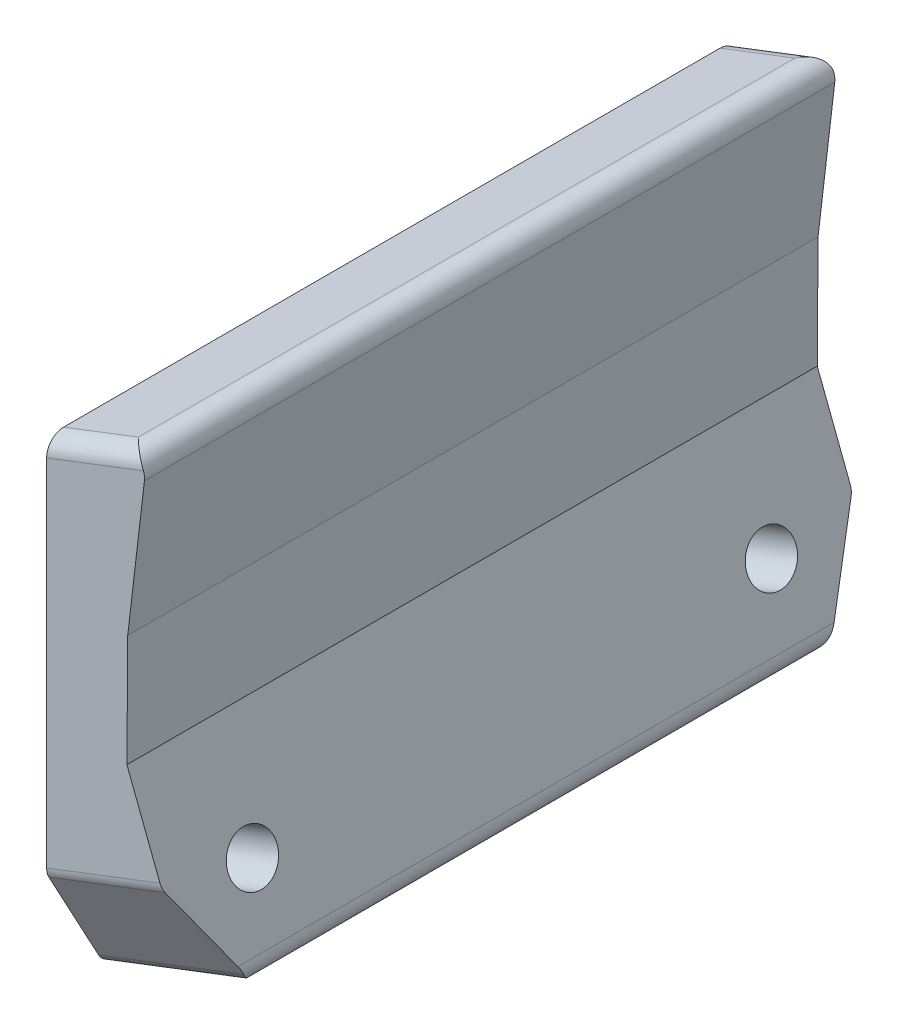
ISO-10303-21;
HEADER;
FILE_DESCRIPTION(('STEP AP214'),'2;1');
FILE_NAME('part.step','',(''),(''),'','','');
FILE_SCHEMA(('AUTOMOTIVE_DESIGN { 1 0 10303 214 1 1 1 1 }'));
ENDSEC;
DATA;
#1=APPLICATION_CONTEXT('core data for automotive mechanical design processes');
#2=APPLICATION_PROTOCOL_DEFINITION('international standard','automotive_design',2000,#1);
#3=PRODUCT_CONTEXT('',#1,'mechanical');
#4=PRODUCT('Part','Part','',(#3));
#5=PRODUCT_RELATED_PRODUCT_CATEGORY('part','',(#4));
#6=PRODUCT_DEFINITION_FORMATION('','',#4);
#7=PRODUCT_DEFINITION_CONTEXT('part definition',#1,'design');
#8=PRODUCT_DEFINITION('design','',#6,#7);
#9=PRODUCT_DEFINITION_SHAPE('','',#8);
#10=(LENGTH_UNIT() NAMED_UNIT(*) SI_UNIT(.MILLI.,.METRE.));
#11=(NAMED_UNIT(*) PLANE_ANGLE_UNIT() SI_UNIT($,.RADIAN.));
#12=(NAMED_UNIT(*) SI_UNIT($,.STERADIAN.) SOLID_ANGLE_UNIT());
#13=UNCERTAINTY_MEASURE_WITH_UNIT(LENGTH_MEASURE(1.E-05),#10,'distance_accuracy_value','');
#14=(GEOMETRIC_REPRESENTATION_CONTEXT(3) GLOBAL_UNCERTAINTY_ASSIGNED_CONTEXT((#13)) GLOBAL_UNIT_ASSIGNED_CONTEXT((#10,
#11,#12)) REPRESENTATION_CONTEXT('',''));
#15=CARTESIAN_POINT('',(0.,0.,0.));
#16=DIRECTION('',(0.,0.,1.));
#17=DIRECTION('',(1.,0.,0.));
#18=AXIS2_PLACEMENT_3D('',#15,#16,#17);
#19=CARTESIAN_POINT('',(0.,28.4733905031528,72.6486526726066));
#20=DIRECTION('',(1.,0.,0.));
#21=DIRECTION('',(0.,0.,-1.));
#22=AXIS2_PLACEMENT_3D('',#19,#20,#21);
#23=PLANE('',#22);
#24=CARTESIAN_POINT('',(0.,5.30631877565072,35.5946375623004));
#25=DIRECTION('',(1.,0.,0.));
#26=DIRECTION('',(0.,1.,0.));
#27=AXIS2_PLACEMENT_3D('',#24,#25,#26);
#28=ELLIPSE('',#27,2.94564875789305,2.74999999999999);
#29=CARTESIAN_POINT('',(0.,3.54191051814975,33.3925530595987));
#30=VERTEX_POINT('',#29);
#31=CARTESIAN_POINT('',(0.,3.54191051814975,37.7967220650021));
#32=VERTEX_POINT('',#31);
#33=EDGE_CURVE('E185',#30,#32,#28,.F.);
#34=ORIENTED_EDGE('',*,*,#33,.F.);
#35=DIRECTION('',(0.,0.,-1.));
#36=VECTOR('',#35,1.);
#37=CARTESIAN_POINT('',(0.,3.54191051814975,72.6486526726066));
#38=LINE('',#37,#36);
#39=CARTESIAN_POINT('',(0.,3.54191051814975,33.3614109376519));
#40=VERTEX_POINT('',#39);
#41=EDGE_CURVE('E194',#30,#40,#38,.T.);
#42=ORIENTED_EDGE('',*,*,#41,.T.);
#43=CARTESIAN_POINT('',(0.,4.27304450538204,35.5946375623004));
#44=DIRECTION('',(1.,0.,0.));
#45=DIRECTION('',(0.,-1.,0.));
#46=AXIS2_PLACEMENT_3D('',#43,#44,#45);
#47=ELLIPSE('',#46,2.69177132163688,2.32046425108158);
#48=CARTESIAN_POINT('',(0.,3.61167121680944,33.3453061200336));
#49=VERTEX_POINT('',#48);
#50=EDGE_CURVE('E233',#40,#49,#47,.T.);
#51=ORIENTED_EDGE('',*,*,#50,.T.);
#52=CARTESIAN_POINT('',(0.,5.30631877565072,35.5946375623004));
#53=DIRECTION('',(1.,0.,0.));
#54=DIRECTION('',(0.,-1.,0.));
#55=AXIS2_PLACEMENT_3D('',#52,#53,#54);
#56=ELLIPSE('',#55,2.94564875789305,2.75);
#57=CARTESIAN_POINT('',(0.,3.61167121680944,37.8439690045673));
#58=VERTEX_POINT('',#57);
#59=EDGE_CURVE('E348',#49,#58,#56,.T.);
#60=ORIENTED_EDGE('',*,*,#59,.T.);
#61=CARTESIAN_POINT('',(0.,3.54191051814975,37.8278641869489));
#62=VERTEX_POINT('',#61);
#63=EDGE_CURVE('E238',#58,#62,#47,.T.);
#64=ORIENTED_EDGE('',*,*,#63,.T.);
#65=EDGE_CURVE('E197',#62,#32,#38,.T.);
#66=ORIENTED_EDGE('',*,*,#65,.T.);
#67=EDGE_LOOP('',(#34,#42,#51,#60,#64,#66));
#68=FACE_BOUND('',#67,.T.);
#69=CARTESIAN_POINT('',(0.,5.29813431758588,5.04556541664107));
#70=DIRECTION('',(1.,0.,0.));
#71=DIRECTION('',(0.,1.,0.));
#72=AXIS2_PLACEMENT_3D('',#69,#70,#71);
#73=ELLIPSE('',#72,2.94564875789305,2.75);
#74=CARTESIAN_POINT('',(0.,3.54191051814976,2.83778597798238));
#75=VERTEX_POINT('',#74);
#76=CARTESIAN_POINT('',(0.,3.54191051814976,7.25334485529976));
#77=VERTEX_POINT('',#76);
#78=EDGE_CURVE('E466',#75,#77,#73,.F.);
#79=ORIENTED_EDGE('',*,*,#78,.F.);
#80=DIRECTION('',(0.,0.,-1.));
#81=VECTOR('',#80,1.);
#82=CARTESIAN_POINT('',(0.,3.54191051814975,72.6486526726066));
#83=LINE('',#82,#81);
#84=CARTESIAN_POINT('',(0.,3.54191051814975,2.80672307074797));
#85=VERTEX_POINT('',#84);
#86=EDGE_CURVE('E224',#75,#85,#83,.T.);
#87=ORIENTED_EDGE('',*,*,#86,.T.);
#88=CARTESIAN_POINT('',(0.,4.26344563880383,5.04556541664107));
#89=DIRECTION('',(1.,0.,0.));
#90=DIRECTION('',(0.,-1.,0.));
#91=AXIS2_PLACEMENT_3D('',#88,#89,#90);
#92=ELLIPSE('',#91,2.69545598154067,2.32364064333873);
#93=CARTESIAN_POINT('',(0.,3.61167121680944,2.79087905813103));
#94=VERTEX_POINT('',#93);
#95=EDGE_CURVE('E339',#85,#94,#92,.T.);
#96=ORIENTED_EDGE('',*,*,#95,.T.);
#97=CARTESIAN_POINT('',(0.,5.29813431758588,5.04556541664107));
#98=DIRECTION('',(1.,0.,0.));
#99=DIRECTION('',(0.,-1.,0.));
#100=AXIS2_PLACEMENT_3D('',#97,#98,#99);
#101=ELLIPSE('',#100,2.94564875789305,2.75);
#102=CARTESIAN_POINT('',(0.,3.61167121680944,7.30025177515111));
#103=VERTEX_POINT('',#102);
#104=EDGE_CURVE('E342',#94,#103,#101,.T.);
#105=ORIENTED_EDGE('',*,*,#104,.T.);
#106=CARTESIAN_POINT('',(0.,3.54191051814975,7.28440776253416));
#107=VERTEX_POINT('',#106);
#108=EDGE_CURVE('E344',#103,#107,#92,.T.);
#109=ORIENTED_EDGE('',*,*,#108,.T.);
#110=EDGE_CURVE('E227',#107,#77,#83,.T.);
#111=ORIENTED_EDGE('',*,*,#110,.T.);
#112=EDGE_LOOP('',(#79,#87,#96,#105,#109,#111));
#113=FACE_BOUND('',#112,.T.);
#114=DIRECTION('',(0.,0.,-1.));
#115=VECTOR('',#114,1.);
#116=CARTESIAN_POINT('',(0.,0.,72.6486526726066));
#117=LINE('',#116,#115);
#118=CARTESIAN_POINT('',(0.,0.,36.7160640643775));
#119=VERTEX_POINT('',#118);
#120=CARTESIAN_POINT('',(0.,0.,3.9239362011463));
#121=VERTEX_POINT('',#120);
#122=EDGE_CURVE('E312',#119,#121,#117,.T.);
#123=ORIENTED_EDGE('',*,*,#122,.F.);
#124=CARTESIAN_POINT('',(0.,1.0711450028702,36.7160640643775));
#125=DIRECTION('',(1.,0.,0.));
#126=DIRECTION('',(0.,1.,0.));
#127=AXIS2_PLACEMENT_3D('',#124,#125,#126);
#128=ELLIPSE('',#127,1.0711450028702,1.);
#129=CARTESIAN_POINT('',(0.,0.535592264773423,37.5821001203966));
#130=VERTEX_POINT('',#129);
#131=EDGE_CURVE('E11',#119,#130,#128,.F.);
#132=ORIENTED_EDGE('',*,*,#131,.T.);
#133=DIRECTION('',(0.,-0.880281845257962,-0.474451128051391));
#134=VECTOR('',#133,1.);
#135=CARTESIAN_POINT('',(0.,10.0195778629525,42.6937444076426));
#136=LINE('',#135,#134);
#137=CARTESIAN_POINT('',(0.,5.9605724205437,40.5060363215429));
#138=VERTEX_POINT('',#137);
#139=EDGE_CURVE('E296',#138,#130,#136,.T.);
#140=ORIENTED_EDGE('',*,*,#139,.F.);
#141=CARTESIAN_POINT('',(0.,6.49612515864048,39.6400002655238));
#142=DIRECTION('',(1.,0.,0.));
#143=DIRECTION('',(0.,-1.,0.));
#144=AXIS2_PLACEMENT_3D('',#141,#142,#143);
#145=ELLIPSE('',#144,1.0711450028702,1.);
#146=CARTESIAN_POINT('',(0.,6.49612515864048,40.6400002655238));
#147=VERTEX_POINT('',#146);
#148=EDGE_CURVE('E289',#138,#147,#145,.F.);
#149=ORIENTED_EDGE('',*,*,#148,.T.);
#150=DIRECTION('',(0.,-1.,0.));
#151=VECTOR('',#150,1.);
#152=CARTESIAN_POINT('',(0.,28.4733905031528,40.6400002655238));
#153=LINE('',#152,#151);
#154=CARTESIAN_POINT('',(0.,27.4019801819633,40.6400002655238));
#155=VERTEX_POINT('',#154);
#156=EDGE_CURVE('E326',#155,#147,#153,.T.);
#157=ORIENTED_EDGE('',*,*,#156,.F.);
#158=CARTESIAN_POINT('',(0.,27.4019801819633,39.6400002655238));
#159=DIRECTION('',(1.,0.,0.));
#160=DIRECTION('',(0.,1.,0.));
#161=AXIS2_PLACEMENT_3D('',#158,#159,#160);
#162=ELLIPSE('',#161,1.07141032118941,1.);
#163=CARTESIAN_POINT('',(0.,28.4733905031528,39.6400002655238));
#164=VERTEX_POINT('',#163);
#165=EDGE_CURVE('E41',#155,#164,#162,.F.);
#166=ORIENTED_EDGE('',*,*,#165,.T.);
#167=DIRECTION('',(0.,0.,-1.));
#168=VECTOR('',#167,1.);
#169=CARTESIAN_POINT('',(0.,28.4733905031528,72.6486526726066));
#170=LINE('',#169,#168);
#171=CARTESIAN_POINT('',(0.,28.4733905031528,1.));
#172=VERTEX_POINT('',#171);
#173=EDGE_CURVE('E322',#164,#172,#170,.T.);
#174=ORIENTED_EDGE('',*,*,#173,.T.);
#175=CARTESIAN_POINT('',(0.,27.4019801819634,1.));
#176=DIRECTION('',(1.,0.,0.));
#177=DIRECTION('',(0.,-1.,0.));
#178=AXIS2_PLACEMENT_3D('',#175,#176,#177);
#179=ELLIPSE('',#178,1.07141032118941,1.);
#180=CARTESIAN_POINT('',(0.,27.4019801819634,0.));
#181=VERTEX_POINT('',#180);
#182=EDGE_CURVE('E287',#172,#181,#179,.F.);
#183=ORIENTED_EDGE('',*,*,#182,.T.);
#184=DIRECTION('',(0.,-1.,0.));
#185=VECTOR('',#184,1.);
#186=CARTESIAN_POINT('',(0.,28.4733905031528,0.));
#187=LINE('',#186,#185);
#188=CARTESIAN_POINT('',(0.,6.49612515864048,0.));
#189=VERTEX_POINT('',#188);
#190=EDGE_CURVE('E317',#181,#189,#187,.T.);
#191=ORIENTED_EDGE('',*,*,#190,.T.);
#192=CARTESIAN_POINT('',(0.,6.49612515864048,1.));
#193=DIRECTION('',(1.,0.,0.));
#194=DIRECTION('',(0.,-1.,0.));
#195=AXIS2_PLACEMENT_3D('',#192,#193,#194);
#196=ELLIPSE('',#195,1.0711450028702,1.);
#197=CARTESIAN_POINT('',(0.,5.9605724205437,0.133963943980832));
#198=VERTEX_POINT('',#197);
#199=EDGE_CURVE('E285',#189,#198,#196,.F.);
#200=ORIENTED_EDGE('',*,*,#199,.T.);
#201=DIRECTION('',(0.,-0.880281845257962,0.474451128051391));
#202=VECTOR('',#201,1.);
#203=CARTESIAN_POINT('',(0.,10.0195778629525,-2.05374414211887));
#204=LINE('',#203,#202);
#205=CARTESIAN_POINT('',(0.,0.535592264773427,3.05790014512713));
#206=VERTEX_POINT('',#205);
#207=EDGE_CURVE('E453',#198,#206,#204,.T.);
#208=ORIENTED_EDGE('',*,*,#207,.T.);
#209=CARTESIAN_POINT('',(0.,1.0711450028702,3.9239362011463));
#210=DIRECTION('',(1.,0.,0.));
#211=DIRECTION('',(0.,-1.,0.));
#212=AXIS2_PLACEMENT_3D('',#209,#210,#211);
#213=ELLIPSE('',#212,1.0711450028702,1.);
#214=EDGE_CURVE('E283',#206,#121,#213,.F.);
#215=ORIENTED_EDGE('',*,*,#214,.T.);
#216=EDGE_LOOP('',(#123,#132,#140,#149,#157,#166,#174,#183,#191,#200,#208,#215));
#217=FACE_BOUND('',#216,.T.);
#218=ADVANCED_FACE('F32',(#68,#113,#217),#23,.F.);
#219=CARTESIAN_POINT('',(0.,0.,72.6486526726066));
#220=DIRECTION('',(-0.358367970509439,0.933580418449823,0.));
#221=DIRECTION('',(-0.933580418449823,-0.358367970509439,0.));
#222=AXIS2_PLACEMENT_3D('',#219,#220,#221);
#223=PLANE('',#222);
#224=DIRECTION('',(0.,0.,-1.));
#225=VECTOR('',#224,1.);
#226=CARTESIAN_POINT('',(7.911843087609,3.03707221602138,72.6486526726066));
#227=LINE('',#226,#225);
#228=CARTESIAN_POINT('',(7.911843087609,3.03707221602138,3.9239362011463));
#229=VERTEX_POINT('',#228);
#230=CARTESIAN_POINT('',(7.911843087609,3.03707221602138,36.7160640643775));
#231=VERTEX_POINT('',#230);
#232=EDGE_CURVE('E274',#229,#231,#227,.F.);
#233=ORIENTED_EDGE('',*,*,#232,.T.);
#234=DIRECTION('',(0.933580418449823,0.358367970509439,0.));
#235=VECTOR('',#234,1.);
#236=CARTESIAN_POINT('',(0.,0.,36.7160640643775));
#237=LINE('',#236,#235);
#238=EDGE_CURVE('E276',#231,#119,#237,.F.);
#239=ORIENTED_EDGE('',*,*,#238,.T.);
#240=ORIENTED_EDGE('',*,*,#122,.T.);
#241=DIRECTION('',(0.933580418449823,0.358367970509439,0.));
#242=VECTOR('',#241,1.);
#243=CARTESIAN_POINT('',(8.84542350605882,3.39544018653082,3.9239362011463));
#244=LINE('',#243,#242);
#245=EDGE_CURVE('E272',#121,#229,#244,.T.);
#246=ORIENTED_EDGE('',*,*,#245,.T.);
#247=EDGE_LOOP('',(#233,#239,#240,#246));
#248=FACE_BOUND('',#247,.T.);
#249=ADVANCED_FACE('F311',(#248),#223,.F.);
#250=CARTESIAN_POINT('',(8.84542350605882,3.39544018653082,72.6486526726066));
#251=DIRECTION('',(-0.933580418449822,-0.358367970509439,0.));
#252=DIRECTION('',(0.358367970509439,-0.933580418449822,0.));
#253=AXIS2_PLACEMENT_3D('',#250,#251,#252);
#254=PLANE('',#253);
#255=CARTESIAN_POINT('',(7.07285150339623,8.01314781711439,5.04556541664107));
#256=DIRECTION('',(-0.933580418449822,-0.358367970509439,0.));
#257=DIRECTION('',(0.358367970509439,-0.933580418449822,0.));
#258=AXIS2_PLACEMENT_3D('',#255,#256,#257);
#259=CIRCLE('',#258,1.45);
#260=CARTESIAN_POINT('',(7.59248506063491,6.65945621036215,5.04556541664107));
#261=VERTEX_POINT('',#260);
#262=EDGE_CURVE('E336',#261,#261,#259,.T.);
#263=ORIENTED_EDGE('',*,*,#262,.T.);
#264=EDGE_LOOP('',(#263));
#265=FACE_BOUND('',#264,.T.);
#266=CARTESIAN_POINT('',(7.07011326756582,8.02028116485394,35.5946375623004));
#267=DIRECTION('',(-0.933580418449822,-0.358367970509439,0.));
#268=DIRECTION('',(0.358367970509439,-0.933580418449822,0.));
#269=AXIS2_PLACEMENT_3D('',#266,#267,#268);
#270=CIRCLE('',#269,1.45);
#271=CARTESIAN_POINT('',(7.58974682480451,6.6665895581017,35.5946375623004));
#272=VERTEX_POINT('',#271);
#273=EDGE_CURVE('E206',#272,#272,#270,.T.);
#274=ORIENTED_EDGE('',*,*,#273,.T.);
#275=EDGE_LOOP('',(#274));
#276=FACE_BOUND('',#275,.T.);
#277=DIRECTION('',(-0.310359583783588,0.808514303571008,0.49998154933434));
#278=VECTOR('',#277,1.);
#279=CARTESIAN_POINT('',(5.1226133917929,13.0936914542011,43.2907827868172));
#280=LINE('',#279,#278);
#281=CARTESIAN_POINT('',(8.48705553554938,4.32902060498065,37.8707503999518));
#282=VERTEX_POINT('',#281);
#283=CARTESIAN_POINT('',(6.85122268758791,8.59051058284575,40.5060363215429));
#284=VERTEX_POINT('',#283);
#285=EDGE_CURVE('E458',#282,#284,#280,.T.);
#286=ORIENTED_EDGE('',*,*,#285,.F.);
#287=DIRECTION('',(0.,0.,-1.));
#288=VECTOR('',#287,1.);
#289=CARTESIAN_POINT('',(8.48705553554938,4.32902060498064,72.6486526726066));
#290=LINE('',#289,#288);
#291=CARTESIAN_POINT('',(8.48705553554938,4.32902060498065,2.76924986557199));
#292=VERTEX_POINT('',#291);
#293=EDGE_CURVE('E262',#282,#292,#290,.T.);
#294=ORIENTED_EDGE('',*,*,#293,.T.);
#295=DIRECTION('',(-0.310359583783588,0.808514303571008,-0.49998154933434));
#296=VECTOR('',#295,1.);
#297=CARTESIAN_POINT('',(5.1226133917929,13.0936914542011,-2.65078252129341));
#298=LINE('',#297,#296);
#299=CARTESIAN_POINT('',(6.85122268758791,8.59051058284575,0.133963943980833));
#300=VERTEX_POINT('',#299);
#301=EDGE_CURVE('E189',#292,#300,#298,.T.);
#302=ORIENTED_EDGE('',*,*,#301,.T.);
#303=CARTESIAN_POINT('',(6.6720453144608,9.05728356689049,1.));
#304=DIRECTION('',(-0.933580418449822,-0.358367970509439,0.));
#305=DIRECTION('',(0.358367970509439,-0.933580418449822,0.));
#306=AXIS2_PLACEMENT_3D('',#303,#304,#305);
#307=CIRCLE('',#306,1.);
#308=CARTESIAN_POINT('',(6.6720453144608,9.05728356689049,0.));
#309=VERTEX_POINT('',#308);
#310=EDGE_CURVE('E258',#300,#309,#307,.F.);
#311=ORIENTED_EDGE('',*,*,#310,.T.);
#312=DIRECTION('',(-0.358367970509439,0.933580418449822,0.));
#313=VECTOR('',#312,1.);
#314=CARTESIAN_POINT('',(8.84542350605882,3.39544018653082,0.));
#315=LINE('',#314,#313);
#316=CARTESIAN_POINT('',(4.72652132843694,14.1255464878049,0.));
#317=VERTEX_POINT('',#316);
#318=EDGE_CURVE('E316',#309,#317,#315,.T.);
#319=ORIENTED_EDGE('',*,*,#318,.T.);
#320=DIRECTION('',(0.,0.,-1.));
#321=VECTOR('',#320,1.);
#322=CARTESIAN_POINT('',(4.72652132843694,14.1255464878049,72.6486526726066));
#323=LINE('',#322,#321);
#324=CARTESIAN_POINT('',(4.72652132843694,14.1255464878049,40.6400002655238));
#325=VERTEX_POINT('',#324);
#326=EDGE_CURVE('E319',#325,#317,#323,.T.);
#327=ORIENTED_EDGE('',*,*,#326,.F.);
#328=DIRECTION('',(-0.358367970509439,0.933580418449822,0.));
#329=VECTOR('',#328,1.);
#330=CARTESIAN_POINT('',(8.84542350605882,3.39544018653082,40.6400002655238));
#331=LINE('',#330,#329);
#332=CARTESIAN_POINT('',(6.6720453144608,9.05728356689049,40.6400002655238));
#333=VERTEX_POINT('',#332);
#334=EDGE_CURVE('E424',#333,#325,#331,.T.);
#335=ORIENTED_EDGE('',*,*,#334,.F.);
#336=CARTESIAN_POINT('',(6.6720453144608,9.05728356689049,39.6400002655238));
#337=DIRECTION('',(-0.933580418449822,-0.358367970509439,0.));
#338=DIRECTION('',(0.358367970509439,-0.933580418449822,0.));
#339=AXIS2_PLACEMENT_3D('',#336,#337,#338);
#340=CIRCLE('',#339,1.);
#341=EDGE_CURVE('E260',#333,#284,#340,.F.);
#342=ORIENTED_EDGE('',*,*,#341,.T.);
#343=EDGE_LOOP('',(#286,#294,#302,#311,#319,#327,#335,#342));
#344=FACE_BOUND('',#343,.T.);
#345=ADVANCED_FACE('F380',(#265,#276,#344),#254,.F.);
#346=CARTESIAN_POINT('',(0.,0.,0.));
#347=DIRECTION('',(0.,0.,1.));
#348=DIRECTION('',(1.,0.,0.));
#349=AXIS2_PLACEMENT_3D('',#346,#347,#348);
#350=PLANE('',#349);
#351=DIRECTION('',(-0.933349231590252,-0.358969653160105,0.));
#352=VECTOR('',#351,1.);
#353=CARTESIAN_POINT('',(-9.1808704165736,23.8709826114933,0.));
#354=LINE('',#353,#352);
#355=CARTESIAN_POINT('',(5.69808427723476,29.5934849986449,0.));
#356=VERTEX_POINT('',#355);
#357=EDGE_CURVE('E245',#181,#356,#354,.F.);
#358=ORIENTED_EDGE('',*,*,#357,.T.);
#359=CARTESIAN_POINT('',(4.76473504564451,29.2345153454847,0.));
#360=DIRECTION('',(0.,0.,1.));
#361=DIRECTION('',(1.,0.,0.));
#362=AXIS2_PLACEMENT_3D('',#359,#360,#361);
#363=CIRCLE('',#362,1.);
#364=CARTESIAN_POINT('',(5.75790672308759,29.1178533588528,0.));
#365=VERTEX_POINT('',#364);
#366=EDGE_CURVE('E247',#356,#365,#363,.F.);
#367=ORIENTED_EDGE('',*,*,#366,.T.);
#368=DIRECTION('',(0.116661986631909,0.993171677443077,0.));
#369=VECTOR('',#368,1.);
#370=CARTESIAN_POINT('',(5.95105715467456,30.7621896476163,0.));
#371=LINE('',#370,#369);
#372=CARTESIAN_POINT('',(4.77389711886644,20.7407418638468,0.));
#373=VERTEX_POINT('',#372);
#374=EDGE_CURVE('E333',#373,#365,#371,.T.);
#375=ORIENTED_EDGE('',*,*,#374,.F.);
#376=DIRECTION('',(0.00716147790735991,0.999974356288291,0.));
#377=VECTOR('',#376,1.);
#378=CARTESIAN_POINT('',(4.72652132843694,14.1255464878049,0.));
#379=LINE('',#378,#377);
#380=EDGE_CURVE('E330',#317,#373,#379,.T.);
#381=ORIENTED_EDGE('',*,*,#380,.F.);
#382=ORIENTED_EDGE('',*,*,#318,.F.);
#383=DIRECTION('',(0.933580418449823,0.358367970509439,0.));
#384=VECTOR('',#383,1.);
#385=CARTESIAN_POINT('',(-0.0960203167292228,6.4592664099415,0.));
#386=LINE('',#385,#384);
#387=EDGE_CURVE('E243',#309,#189,#386,.F.);
#388=ORIENTED_EDGE('',*,*,#387,.T.);
#389=ORIENTED_EDGE('',*,*,#190,.F.);
#390=EDGE_LOOP('',(#358,#367,#375,#381,#382,#388,#389));
#391=FACE_BOUND('',#390,.T.);
#392=ADVANCED_FACE('F448',(#391),#350,.F.);
#393=CARTESIAN_POINT('',(-0.590309813047169,5.07972005368439,38.3696375623004));
#394=DIRECTION('',(-0.933580418449822,-0.358367970509439,0.));
#395=DIRECTION('',(0.358367970509439,-0.933580418449822,0.));
#396=AXIS2_PLACEMENT_3D('',#393,#394,#395);
#397=PLANE('',#396);
#398=CARTESIAN_POINT('',(-0.590309813047169,5.07972005368439,35.5946375623004));
#399=DIRECTION('',(-0.933580418449822,-0.358367970509439,0.));
#400=DIRECTION('',(0.358367970509439,-0.933580418449822,0.));
#401=AXIS2_PLACEMENT_3D('',#398,#399,#400);
#402=CIRCLE('',#401,2.74999999999999);
#403=EDGE_CURVE('E182',#32,#30,#402,.F.);
#404=ORIENTED_EDGE('',*,*,#403,.F.);
#405=ORIENTED_EDGE('',*,*,#65,.F.);
#406=CARTESIAN_POINT('',(-0.59030981304717,5.07972005368439,35.5946375623004));
#407=DIRECTION('',(-0.933580418449822,-0.358367970509439,0.));
#408=DIRECTION('',(0.358367970509439,-0.933580418449822,0.));
#409=AXIS2_PLACEMENT_3D('',#406,#407,#408);
#410=CIRCLE('',#409,2.775);
#411=EDGE_CURVE('E203',#40,#62,#410,.T.);
#412=ORIENTED_EDGE('',*,*,#411,.F.);
#413=ORIENTED_EDGE('',*,*,#41,.F.);
#414=EDGE_LOOP('',(#404,#405,#412,#413));
#415=FACE_BOUND('',#414,.T.);
#416=ADVANCED_FACE('F201',(#415),#397,.F.);
#417=CARTESIAN_POINT('',(-0.587571577216766,5.07258670594484,7.82056541664107));
#418=DIRECTION('',(-0.933580418449822,-0.358367970509439,0.));
#419=DIRECTION('',(0.358367970509439,-0.933580418449822,0.));
#420=AXIS2_PLACEMENT_3D('',#417,#418,#419);
#421=PLANE('',#420);
#422=CARTESIAN_POINT('',(-0.587571577216765,5.07258670594484,5.04556541664107));
#423=DIRECTION('',(-0.933580418449822,-0.358367970509439,0.));
#424=DIRECTION('',(0.358367970509439,-0.933580418449822,0.));
#425=AXIS2_PLACEMENT_3D('',#422,#423,#424);
#426=CIRCLE('',#425,2.75);
#427=EDGE_CURVE('E198',#77,#75,#426,.F.);
#428=ORIENTED_EDGE('',*,*,#427,.F.);
#429=ORIENTED_EDGE('',*,*,#110,.F.);
#430=CARTESIAN_POINT('',(-0.587571577216767,5.07258670594484,5.04556541664107));
#431=DIRECTION('',(-0.933580418449822,-0.358367970509439,0.));
#432=DIRECTION('',(0.358367970509439,-0.933580418449822,0.));
#433=AXIS2_PLACEMENT_3D('',#430,#431,#432);
#434=CIRCLE('',#433,2.775);
#435=EDGE_CURVE('E212',#85,#107,#434,.T.);
#436=ORIENTED_EDGE('',*,*,#435,.F.);
#437=ORIENTED_EDGE('',*,*,#86,.F.);
#438=EDGE_LOOP('',(#428,#429,#436,#437));
#439=FACE_BOUND('',#438,.T.);
#440=ADVANCED_FACE('F501',(#439),#421,.F.);
#441=CARTESIAN_POINT('',(4.72652132843694,14.1255464878049,72.6486526726066));
#442=DIRECTION('',(-0.999974356288291,0.00716147790735991,0.));
#443=DIRECTION('',(-0.00716147790735991,-0.999974356288291,0.));
#444=AXIS2_PLACEMENT_3D('',#441,#442,#443);
#445=PLANE('',#444);
#446=DIRECTION('',(0.00716147790735991,0.999974356288291,0.));
#447=VECTOR('',#446,1.);
#448=CARTESIAN_POINT('',(4.72652132843694,14.1255464878049,40.6400002655238));
#449=LINE('',#448,#447);
#450=CARTESIAN_POINT('',(4.77389711886644,20.7407418638468,40.6400002655238));
#451=VERTEX_POINT('',#450);
#452=EDGE_CURVE('E425',#325,#451,#449,.T.);
#453=ORIENTED_EDGE('',*,*,#452,.F.);
#454=ORIENTED_EDGE('',*,*,#326,.T.);
#455=ORIENTED_EDGE('',*,*,#380,.T.);
#456=DIRECTION('',(0.,0.,-1.));
#457=VECTOR('',#456,1.);
#458=CARTESIAN_POINT('',(4.77389711886644,20.7407418638468,72.6486526726066));
#459=LINE('',#458,#457);
#460=EDGE_CURVE('E331',#451,#373,#459,.T.);
#461=ORIENTED_EDGE('',*,*,#460,.F.);
#462=EDGE_LOOP('',(#453,#454,#455,#461));
#463=FACE_BOUND('',#462,.T.);
#464=ADVANCED_FACE('F440',(#463),#445,.F.);
#465=CARTESIAN_POINT('',(5.95105715467456,30.7621896476163,72.6486526726066));
#466=DIRECTION('',(-0.993171677443077,0.116661986631909,0.));
#467=DIRECTION('',(-0.116661986631909,-0.993171677443077,0.));
#468=AXIS2_PLACEMENT_3D('',#465,#466,#467);
#469=PLANE('',#468);
#470=ORIENTED_EDGE('',*,*,#374,.T.);
#471=DIRECTION('',(0.,0.,-1.));
#472=VECTOR('',#471,1.);
#473=CARTESIAN_POINT('',(5.75790672308759,29.1178533588528,72.6486526726066));
#474=LINE('',#473,#472);
#475=CARTESIAN_POINT('',(5.75790672308759,29.1178533588528,40.6400002655238));
#476=VERTEX_POINT('',#475);
#477=EDGE_CURVE('E249',#365,#476,#474,.F.);
#478=ORIENTED_EDGE('',*,*,#477,.T.);
#479=DIRECTION('',(0.116661986631909,0.993171677443077,0.));
#480=VECTOR('',#479,1.);
#481=CARTESIAN_POINT('',(5.95105715467456,30.7621896476163,40.6400002655238));
#482=LINE('',#481,#480);
#483=EDGE_CURVE('E343',#451,#476,#482,.T.);
#484=ORIENTED_EDGE('',*,*,#483,.F.);
#485=ORIENTED_EDGE('',*,*,#460,.T.);
#486=EDGE_LOOP('',(#470,#478,#484,#485));
#487=FACE_BOUND('',#486,.T.);
#488=ADVANCED_FACE('F516',(#487),#469,.F.);
#489=CARTESIAN_POINT('',(0.,28.4733905031528,72.6486526726066));
#490=DIRECTION('',(0.358969653160105,-0.933349231590252,0.));
#491=DIRECTION('',(0.933349231590252,0.358969653160105,0.));
#492=AXIS2_PLACEMENT_3D('',#489,#490,#491);
#493=PLANE('',#492);
#494=ORIENTED_EDGE('',*,*,#173,.F.);
#495=DIRECTION('',(-0.933349231590252,-0.358969653160105,0.));
#496=VECTOR('',#495,1.);
#497=CARTESIAN_POINT('',(5.95105715467457,30.7621896476163,39.6400002655238));
#498=LINE('',#497,#496);
#499=CARTESIAN_POINT('',(4.4057653924844,30.167864577075,39.6400002655238));
#500=VERTEX_POINT('',#499);
#501=EDGE_CURVE('E241',#164,#500,#498,.F.);
#502=ORIENTED_EDGE('',*,*,#501,.T.);
#503=DIRECTION('',(0.,0.,-1.));
#504=VECTOR('',#503,1.);
#505=CARTESIAN_POINT('',(4.4057653924844,30.167864577075,72.6486526726066));
#506=LINE('',#505,#504);
#507=CARTESIAN_POINT('',(4.4057653924844,30.167864577075,1.));
#508=VERTEX_POINT('',#507);
#509=EDGE_CURVE('E237',#500,#508,#506,.T.);
#510=ORIENTED_EDGE('',*,*,#509,.T.);
#511=DIRECTION('',(-0.933349231590252,-0.358969653160105,0.));
#512=VECTOR('',#511,1.);
#513=CARTESIAN_POINT('',(0.,28.4733905031528,1.));
#514=LINE('',#513,#512);
#515=EDGE_CURVE('E235',#508,#172,#514,.T.);
#516=ORIENTED_EDGE('',*,*,#515,.T.);
#517=EDGE_LOOP('',(#494,#502,#510,#516));
#518=FACE_BOUND('',#517,.T.);
#519=ADVANCED_FACE('F386',(#518),#493,.F.);
#520=CARTESIAN_POINT('',(0.,0.,40.6400002655238));
#521=DIRECTION('',(0.,0.,1.));
#522=DIRECTION('',(1.,0.,0.));
#523=AXIS2_PLACEMENT_3D('',#520,#521,#522);
#524=PLANE('',#523);
#525=ORIENTED_EDGE('',*,*,#483,.T.);
#526=CARTESIAN_POINT('',(4.76473504564451,29.2345153454847,40.6400002655238));
#527=DIRECTION('',(0.,0.,1.));
#528=DIRECTION('',(1.,0.,0.));
#529=AXIS2_PLACEMENT_3D('',#526,#527,#528);
#530=CIRCLE('',#529,1.);
#531=CARTESIAN_POINT('',(5.69808427723476,29.5934849986449,40.6400002655238));
#532=VERTEX_POINT('',#531);
#533=EDGE_CURVE('E256',#476,#532,#530,.T.);
#534=ORIENTED_EDGE('',*,*,#533,.T.);
#535=DIRECTION('',(-0.933349231590252,-0.358969653160105,0.));
#536=VECTOR('',#535,1.);
#537=CARTESIAN_POINT('',(0.358969653160108,27.5400412715625,40.6400002655238));
#538=LINE('',#537,#536);
#539=EDGE_CURVE('E254',#532,#155,#538,.T.);
#540=ORIENTED_EDGE('',*,*,#539,.T.);
#541=ORIENTED_EDGE('',*,*,#156,.T.);
#542=DIRECTION('',(0.933580418449823,0.358367970509439,0.));
#543=VECTOR('',#542,1.);
#544=CARTESIAN_POINT('',(6.6720453144608,9.05728356689049,40.6400002655238));
#545=LINE('',#544,#543);
#546=EDGE_CURVE('E251',#147,#333,#545,.T.);
#547=ORIENTED_EDGE('',*,*,#546,.T.);
#548=ORIENTED_EDGE('',*,*,#334,.T.);
#549=ORIENTED_EDGE('',*,*,#452,.T.);
#550=EDGE_LOOP('',(#525,#534,#540,#541,#547,#548,#549));
#551=FACE_BOUND('',#550,.T.);
#552=ADVANCED_FACE('F371',(#551),#524,.T.);
#553=CARTESIAN_POINT('',(-0.587571577216767,5.07258670594484,5.04556541664107));
#554=DIRECTION('',(-0.933580418449822,-0.358367970509439,0.));
#555=DIRECTION('',(0.358367970509439,-0.933580418449822,0.));
#556=AXIS2_PLACEMENT_3D('',#553,#554,#555);
#557=CONICAL_SURFACE('',#556,2.775,0.785398163397647);
#558=CARTESIAN_POINT('',(-0.564232066755526,5.08154590520757,5.04556541664107));
#559=DIRECTION('',(-0.933580418449822,-0.358367970509439,0.));
#560=DIRECTION('',(0.358367970509439,-0.933580418449822,0.));
#561=AXIS2_PLACEMENT_3D('',#558,#559,#560);
#562=CIRCLE('',#561,2.75);
#563=EDGE_CURVE('E215',#94,#103,#562,.T.);
#564=ORIENTED_EDGE('',*,*,#563,.F.);
#565=ORIENTED_EDGE('',*,*,#95,.F.);
#566=ORIENTED_EDGE('',*,*,#435,.T.);
#567=ORIENTED_EDGE('',*,*,#108,.F.);
#568=EDGE_LOOP('',(#564,#565,#566,#567));
#569=FACE_BOUND('',#568,.T.);
#570=ADVANCED_FACE('F355',(#569),#557,.F.);
#571=CARTESIAN_POINT('',(-0.587571577216764,5.07258670594484,5.04556541664107));
#572=DIRECTION('',(-0.933580418449822,-0.358367970509439,0.));
#573=DIRECTION('',(0.358367970509439,-0.933580418449822,0.));
#574=AXIS2_PLACEMENT_3D('',#571,#572,#573);
#575=CYLINDRICAL_SURFACE('',#574,2.75);
#576=CARTESIAN_POINT('',(1.74637946890778,5.96850663221844,5.04556541664107));
#577=DIRECTION('',(-0.933580418449822,-0.358367970509439,0.));
#578=DIRECTION('',(0.358367970509439,-0.933580418449822,0.));
#579=AXIS2_PLACEMENT_3D('',#576,#577,#578);
#580=CIRCLE('',#579,2.75);
#581=CARTESIAN_POINT('',(2.73189138780874,3.40116048148143,5.04556541664107));
#582=VERTEX_POINT('',#581);
#583=EDGE_CURVE('E218',#582,#582,#580,.T.);
#584=ORIENTED_EDGE('',*,*,#583,.F.);
#585=EDGE_LOOP('',(#584));
#586=FACE_BOUND('',#585,.T.);
#587=ORIENTED_EDGE('',*,*,#563,.T.);
#588=ORIENTED_EDGE('',*,*,#104,.F.);
#589=EDGE_LOOP('',(#587,#588));
#590=FACE_BOUND('',#589,.T.);
#591=ADVANCED_FACE('F359',(#586,#590),#575,.F.);
#592=CARTESIAN_POINT('',(-0.587571577216764,5.07258670594484,5.04556541664107));
#593=DIRECTION('',(-0.933580418449822,-0.358367970509439,0.));
#594=DIRECTION('',(0.358367970509439,-0.933580418449822,0.));
#595=AXIS2_PLACEMENT_3D('',#592,#593,#594);
#596=CYLINDRICAL_SURFACE('',#595,1.45);
#597=CARTESIAN_POINT('',(1.74637946890778,5.96850663221844,5.04556541664107));
#598=DIRECTION('',(-0.933580418449822,-0.358367970509439,0.));
#599=DIRECTION('',(0.358367970509439,-0.933580418449822,0.));
#600=AXIS2_PLACEMENT_3D('',#597,#598,#599);
#601=CIRCLE('',#600,1.45000000000001);
#602=CARTESIAN_POINT('',(2.26601302614648,4.61481502546618,5.04556541664107));
#603=VERTEX_POINT('',#602);
#604=EDGE_CURVE('E221',#603,#603,#601,.T.);
#605=ORIENTED_EDGE('',*,*,#604,.T.);
#606=EDGE_LOOP('',(#605));
#607=FACE_BOUND('',#606,.T.);
#608=ORIENTED_EDGE('',*,*,#262,.F.);
#609=EDGE_LOOP('',(#608));
#610=FACE_BOUND('',#609,.T.);
#611=ADVANCED_FACE('F361',(#607,#610),#596,.F.);
#612=CARTESIAN_POINT('',(1.74637946890778,5.96850663221844,7.79556541664106));
#613=DIRECTION('',(0.933580418449822,0.358367970509439,0.));
#614=DIRECTION('',(-0.358367970509439,0.933580418449822,0.));
#615=AXIS2_PLACEMENT_3D('',#612,#613,#614);
#616=PLANE('',#615);
#617=ORIENTED_EDGE('',*,*,#604,.F.);
#618=EDGE_LOOP('',(#617));
#619=FACE_BOUND('',#618,.T.);
#620=ORIENTED_EDGE('',*,*,#583,.T.);
#621=EDGE_LOOP('',(#620));
#622=FACE_BOUND('',#621,.T.);
#623=ADVANCED_FACE('F368',(#619,#622),#616,.F.);
#624=CARTESIAN_POINT('',(-0.59030981304717,5.07972005368439,35.5946375623004));
#625=DIRECTION('',(-0.933580418449822,-0.358367970509439,0.));
#626=DIRECTION('',(0.358367970509439,-0.933580418449822,0.));
#627=AXIS2_PLACEMENT_3D('',#624,#625,#626);
#628=CONICAL_SURFACE('',#627,2.775,0.78539816339763);
#629=CARTESIAN_POINT('',(-0.566970302585929,5.08867925294713,35.5946375623004));
#630=DIRECTION('',(-0.933580418449822,-0.358367970509439,0.));
#631=DIRECTION('',(0.358367970509439,-0.933580418449822,0.));
#632=AXIS2_PLACEMENT_3D('',#629,#630,#631);
#633=CIRCLE('',#632,2.75);
#634=EDGE_CURVE('E469',#49,#58,#633,.T.);
#635=ORIENTED_EDGE('',*,*,#634,.F.);
#636=ORIENTED_EDGE('',*,*,#50,.F.);
#637=ORIENTED_EDGE('',*,*,#411,.T.);
#638=ORIENTED_EDGE('',*,*,#63,.F.);
#639=EDGE_LOOP('',(#635,#636,#637,#638));
#640=FACE_BOUND('',#639,.T.);
#641=ADVANCED_FACE('F479',(#640),#628,.F.);
#642=CARTESIAN_POINT('',(-0.590309813047167,5.07972005368439,35.5946375623004));
#643=DIRECTION('',(-0.933580418449822,-0.358367970509439,0.));
#644=DIRECTION('',(0.358367970509439,-0.933580418449822,0.));
#645=AXIS2_PLACEMENT_3D('',#642,#643,#644);
#646=CYLINDRICAL_SURFACE('',#645,2.75);
#647=CARTESIAN_POINT('',(1.74364123307738,5.97563997995799,35.5946375623004));
#648=DIRECTION('',(-0.933580418449822,-0.358367970509439,0.));
#649=DIRECTION('',(0.358367970509439,-0.933580418449822,0.));
#650=AXIS2_PLACEMENT_3D('',#647,#648,#649);
#651=CIRCLE('',#650,2.75);
#652=CARTESIAN_POINT('',(2.72915315197834,3.40829382922098,35.5946375623004));
#653=VERTEX_POINT('',#652);
#654=EDGE_CURVE('E208',#653,#653,#651,.T.);
#655=ORIENTED_EDGE('',*,*,#654,.F.);
#656=EDGE_LOOP('',(#655));
#657=FACE_BOUND('',#656,.T.);
#658=ORIENTED_EDGE('',*,*,#634,.T.);
#659=ORIENTED_EDGE('',*,*,#59,.F.);
#660=EDGE_LOOP('',(#658,#659));
#661=FACE_BOUND('',#660,.T.);
#662=ADVANCED_FACE('F475',(#657,#661),#646,.F.);
#663=CARTESIAN_POINT('',(-0.590309813047167,5.07972005368439,35.5946375623004));
#664=DIRECTION('',(-0.933580418449822,-0.358367970509439,0.));
#665=DIRECTION('',(0.358367970509439,-0.933580418449822,0.));
#666=AXIS2_PLACEMENT_3D('',#663,#664,#665);
#667=CYLINDRICAL_SURFACE('',#666,1.45);
#668=CARTESIAN_POINT('',(1.74364123307738,5.97563997995799,35.5946375623004));
#669=DIRECTION('',(-0.933580418449822,-0.358367970509439,0.));
#670=DIRECTION('',(0.358367970509439,-0.933580418449822,0.));
#671=AXIS2_PLACEMENT_3D('',#668,#669,#670);
#672=CIRCLE('',#671,1.45000000000001);
#673=CARTESIAN_POINT('',(2.26327479031607,4.62194837320573,35.5946375623004));
#674=VERTEX_POINT('',#673);
#675=EDGE_CURVE('E204',#674,#674,#672,.T.);
#676=ORIENTED_EDGE('',*,*,#675,.T.);
#677=EDGE_LOOP('',(#676));
#678=FACE_BOUND('',#677,.T.);
#679=ORIENTED_EDGE('',*,*,#273,.F.);
#680=EDGE_LOOP('',(#679));
#681=FACE_BOUND('',#680,.T.);
#682=ADVANCED_FACE('F478',(#678,#681),#667,.F.);
#683=CARTESIAN_POINT('',(1.74364123307738,5.97563997995799,38.3446375623004));
#684=DIRECTION('',(0.933580418449822,0.358367970509439,0.));
#685=DIRECTION('',(-0.358367970509439,0.933580418449822,0.));
#686=AXIS2_PLACEMENT_3D('',#683,#684,#685);
#687=PLANE('',#686);
#688=ORIENTED_EDGE('',*,*,#675,.F.);
#689=EDGE_LOOP('',(#688));
#690=FACE_BOUND('',#689,.T.);
#691=ORIENTED_EDGE('',*,*,#654,.T.);
#692=EDGE_LOOP('',(#691));
#693=FACE_BOUND('',#692,.T.);
#694=ADVANCED_FACE('F473',(#690,#693),#687,.F.);
#695=CARTESIAN_POINT('',(-1.790227555832,4.61093029824829,5.04556541664107));
#696=DIRECTION('',(0.933580418449822,0.358367970509439,0.));
#697=DIRECTION('',(-0.358367970509439,0.933580418449823,0.));
#698=AXIS2_PLACEMENT_3D('',#695,#696,#697);
#699=CYLINDRICAL_SURFACE('',#698,2.75);
#700=ORIENTED_EDGE('',*,*,#78,.T.);
#701=ORIENTED_EDGE('',*,*,#427,.T.);
#702=EDGE_LOOP('',(#700,#701));
#703=FACE_BOUND('',#702,.T.);
#704=ADVANCED_FACE('F491',(#703),#699,.F.);
#705=CARTESIAN_POINT('',(-1.7929657916624,4.61806364598785,35.5946375623004));
#706=DIRECTION('',(0.933580418449822,0.358367970509439,0.));
#707=DIRECTION('',(-0.358367970509439,0.933580418449823,0.));
#708=AXIS2_PLACEMENT_3D('',#705,#706,#707);
#709=CYLINDRICAL_SURFACE('',#708,2.74999999999999);
#710=ORIENTED_EDGE('',*,*,#33,.T.);
#711=ORIENTED_EDGE('',*,*,#403,.T.);
#712=EDGE_LOOP('',(#710,#711));
#713=FACE_BOUND('',#712,.T.);
#714=ADVANCED_FACE('F184',(#713),#709,.F.);
#715=CARTESIAN_POINT('',(-3.7240162519835,9.69778827474817,-2.65078252129341));
#716=DIRECTION('',(0.179177373127112,-0.466772984044743,-0.866036056019167));
#717=DIRECTION('',(0.,0.880281845257962,-0.474451128051391));
#718=AXIS2_PLACEMENT_3D('',#715,#716,#717);
#719=PLANE('',#718);
#720=ORIENTED_EDGE('',*,*,#207,.F.);
#721=DIRECTION('',(0.933580418449823,0.358367970509439,0.));
#722=VECTOR('',#721,1.);
#723=CARTESIAN_POINT('',(6.85122268758792,8.59051058284575,0.133963943980833));
#724=LINE('',#723,#722);
#725=EDGE_CURVE('E269',#198,#300,#724,.T.);
#726=ORIENTED_EDGE('',*,*,#725,.T.);
#727=ORIENTED_EDGE('',*,*,#301,.F.);
#728=CARTESIAN_POINT('',(7.55347511709956,3.9706526344712,2.76924986557199));
#729=DIRECTION('',(0.179177373127112,-0.466772984044743,-0.866036056019167));
#730=DIRECTION('',(-0.310359583783588,0.808514303571008,-0.49998154933434));
#731=AXIS2_PLACEMENT_3D('',#728,#729,#730);
#732=ELLIPSE('',#731,1.15468633557431,1.);
#733=CARTESIAN_POINT('',(8.54116679379773,3.81423923421007,3.05790014512713));
#734=VERTEX_POINT('',#733);
#735=EDGE_CURVE('E267',#292,#734,#732,.T.);
#736=ORIENTED_EDGE('',*,*,#735,.T.);
#737=DIRECTION('',(0.933580418449823,0.358367970509439,0.));
#738=VECTOR('',#737,1.);
#739=CARTESIAN_POINT('',(-0.179190597382327,0.466807434405081,3.05790014512713));
#740=LINE('',#739,#738);
#741=EDGE_CURVE('E265',#734,#206,#740,.F.);
#742=ORIENTED_EDGE('',*,*,#741,.T.);
#743=EDGE_LOOP('',(#720,#726,#727,#736,#742));
#744=FACE_BOUND('',#743,.T.);
#745=ADVANCED_FACE('F455',(#744),#719,.T.);
#746=CARTESIAN_POINT('',(-3.7240162519835,9.69778827474817,43.2907827868172));
#747=DIRECTION('',(-0.179177373127112,0.466772984044743,-0.866036056019167));
#748=DIRECTION('',(0.,0.880281845257962,0.474451128051391));
#749=AXIS2_PLACEMENT_3D('',#746,#747,#748);
#750=PLANE('',#749);
#751=DIRECTION('',(0.933580418449823,0.358367970509439,0.));
#752=VECTOR('',#751,1.);
#753=CARTESIAN_POINT('',(-0.180396735099907,0.466344441482922,37.5821001203966));
#754=LINE('',#753,#752);
#755=CARTESIAN_POINT('',(8.54116679379772,3.81423923421006,37.5821001203966));
#756=VERTEX_POINT('',#755);
#757=EDGE_CURVE('E49',#130,#756,#754,.T.);
#758=ORIENTED_EDGE('',*,*,#757,.T.);
#759=CARTESIAN_POINT('',(7.55347511709956,3.9706526344712,37.8707503999518));
#760=DIRECTION('',(-0.179177373127112,0.466772984044743,-0.866036056019167));
#761=DIRECTION('',(0.310359583783588,-0.808514303571008,-0.49998154933434));
#762=AXIS2_PLACEMENT_3D('',#759,#760,#761);
#763=ELLIPSE('',#762,1.15468633557431,1.);
#764=EDGE_CURVE('E281',#756,#282,#763,.F.);
#765=ORIENTED_EDGE('',*,*,#764,.T.);
#766=ORIENTED_EDGE('',*,*,#285,.T.);
#767=DIRECTION('',(0.933580418449823,0.358367970509439,0.));
#768=VECTOR('',#767,1.);
#769=CARTESIAN_POINT('',(0.0831570563978896,5.99249342589676,40.5060363215429));
#770=LINE('',#769,#768);
#771=EDGE_CURVE('E278',#284,#138,#770,.F.);
#772=ORIENTED_EDGE('',*,*,#771,.T.);
#773=ORIENTED_EDGE('',*,*,#139,.T.);
#774=EDGE_LOOP('',(#758,#765,#766,#772,#773));
#775=FACE_BOUND('',#774,.T.);
#776=ADVANCED_FACE('F399',(#775),#750,.F.);
#777=CARTESIAN_POINT('',(-9.1808704165736,23.8709826114933,39.6400002655238));
#778=DIRECTION('',(0.933349231590252,0.358969653160105,0.));
#779=DIRECTION('',(-0.358969653160105,0.933349231590252,0.));
#780=AXIS2_PLACEMENT_3D('',#777,#778,#779);
#781=CYLINDRICAL_SURFACE('',#780,1.);
#782=ORIENTED_EDGE('',*,*,#165,.F.);
#783=ORIENTED_EDGE('',*,*,#539,.F.);
#784=CARTESIAN_POINT('',(4.76473504564451,29.2345153454847,39.6400002655238));
#785=DIRECTION('',(0.659977570872721,0.253829875989693,-0.707106781186547));
#786=DIRECTION('',(0.659977570872721,0.253829875989693,0.707106781186547));
#787=AXIS2_PLACEMENT_3D('',#784,#785,#786);
#788=ELLIPSE('',#787,1.41421356237309,1.);
#789=EDGE_CURVE('E294',#500,#532,#788,.T.);
#790=ORIENTED_EDGE('',*,*,#789,.F.);
#791=ORIENTED_EDGE('',*,*,#501,.F.);
#792=EDGE_LOOP('',(#782,#783,#790,#791));
#793=FACE_BOUND('',#792,.T.);
#794=ADVANCED_FACE('F395',(#793),#781,.T.);
#795=CARTESIAN_POINT('',(0.358969653160105,27.5400412715625,1.));
#796=DIRECTION('',(-0.933349231590252,-0.358969653160105,0.));
#797=DIRECTION('',(0.358969653160105,-0.933349231590252,0.));
#798=AXIS2_PLACEMENT_3D('',#795,#796,#797);
#799=CYLINDRICAL_SURFACE('',#798,1.);
#800=ORIENTED_EDGE('',*,*,#182,.F.);
#801=ORIENTED_EDGE('',*,*,#515,.F.);
#802=CARTESIAN_POINT('',(4.76473504564451,29.2345153454847,1.));
#803=DIRECTION('',(-0.659977570872721,-0.253829875989693,-0.707106781186547));
#804=DIRECTION('',(-0.659977570872721,-0.253829875989693,0.707106781186547));
#805=AXIS2_PLACEMENT_3D('',#802,#803,#804);
#806=ELLIPSE('',#805,1.41421356237309,1.);
#807=EDGE_CURVE('E292',#356,#508,#806,.F.);
#808=ORIENTED_EDGE('',*,*,#807,.F.);
#809=ORIENTED_EDGE('',*,*,#357,.F.);
#810=EDGE_LOOP('',(#800,#801,#808,#809));
#811=FACE_BOUND('',#810,.T.);
#812=ADVANCED_FACE('F391',(#811),#799,.T.);
#813=CARTESIAN_POINT('',(4.76473504564451,29.2345153454847,72.6486526726066));
#814=DIRECTION('',(0.,0.,-1.));
#815=DIRECTION('',(-1.,0.,0.));
#816=AXIS2_PLACEMENT_3D('',#813,#814,#815);
#817=CYLINDRICAL_SURFACE('',#816,1.);
#818=ORIENTED_EDGE('',*,*,#533,.F.);
#819=ORIENTED_EDGE('',*,*,#477,.F.);
#820=ORIENTED_EDGE('',*,*,#366,.F.);
#821=ORIENTED_EDGE('',*,*,#807,.T.);
#822=ORIENTED_EDGE('',*,*,#509,.F.);
#823=ORIENTED_EDGE('',*,*,#789,.T.);
#824=EDGE_LOOP('',(#818,#819,#820,#821,#822,#823));
#825=FACE_BOUND('',#824,.T.);
#826=ADVANCED_FACE('F388',(#825),#817,.T.);
#827=CARTESIAN_POINT('',(-0.35957410822702,0.933117425527668,36.7160640643775));
#828=DIRECTION('',(0.933580418449823,0.358367970509439,0.));
#829=DIRECTION('',(-0.358367970509439,0.933580418449823,0.));
#830=AXIS2_PLACEMENT_3D('',#827,#828,#829);
#831=CYLINDRICAL_SURFACE('',#830,1.);
#832=ORIENTED_EDGE('',*,*,#131,.F.);
#833=ORIENTED_EDGE('',*,*,#238,.F.);
#834=CARTESIAN_POINT('',(7.55347511709956,3.9706526344712,36.7160640643775));
#835=DIRECTION('',(0.660141044668844,0.253404422107285,-0.707106781186547));
#836=DIRECTION('',(0.660141044668844,0.253404422107285,0.707106781186547));
#837=AXIS2_PLACEMENT_3D('',#834,#835,#836);
#838=ELLIPSE('',#837,1.41421356237309,1.);
#839=EDGE_CURVE('E36',#756,#231,#838,.T.);
#840=ORIENTED_EDGE('',*,*,#839,.F.);
#841=ORIENTED_EDGE('',*,*,#757,.F.);
#842=EDGE_LOOP('',(#832,#833,#840,#841));
#843=FACE_BOUND('',#842,.T.);
#844=ADVANCED_FACE('F308',(#843),#831,.T.);
#845=CARTESIAN_POINT('',(-0.358367970509435,0.933580418449824,3.9239362011463));
#846=DIRECTION('',(-0.933580418449823,-0.358367970509439,0.));
#847=DIRECTION('',(0.358367970509439,-0.933580418449823,0.));
#848=AXIS2_PLACEMENT_3D('',#845,#846,#847);
#849=CYLINDRICAL_SURFACE('',#848,1.);
#850=ORIENTED_EDGE('',*,*,#214,.F.);
#851=ORIENTED_EDGE('',*,*,#741,.F.);
#852=CARTESIAN_POINT('',(7.55347511709956,3.9706526344712,3.9239362011463));
#853=DIRECTION('',(-0.660141044668844,-0.253404422107285,-0.707106781186547));
#854=DIRECTION('',(-0.660141044668844,-0.253404422107285,0.707106781186547));
#855=AXIS2_PLACEMENT_3D('',#852,#853,#854);
#856=ELLIPSE('',#855,1.41421356237309,1.);
#857=EDGE_CURVE('E297',#229,#734,#856,.F.);
#858=ORIENTED_EDGE('',*,*,#857,.F.);
#859=ORIENTED_EDGE('',*,*,#245,.F.);
#860=EDGE_LOOP('',(#850,#851,#858,#859));
#861=FACE_BOUND('',#860,.T.);
#862=ADVANCED_FACE('F404',(#861),#849,.T.);
#863=CARTESIAN_POINT('',(7.55347511709956,3.9706526344712,72.6486526726066));
#864=DIRECTION('',(0.,0.,-1.));
#865=DIRECTION('',(-1.,0.,0.));
#866=AXIS2_PLACEMENT_3D('',#863,#864,#865);
#867=CYLINDRICAL_SURFACE('',#866,1.);
#868=ORIENTED_EDGE('',*,*,#839,.T.);
#869=ORIENTED_EDGE('',*,*,#232,.F.);
#870=ORIENTED_EDGE('',*,*,#857,.T.);
#871=ORIENTED_EDGE('',*,*,#735,.F.);
#872=ORIENTED_EDGE('',*,*,#293,.F.);
#873=ORIENTED_EDGE('',*,*,#764,.F.);
#874=EDGE_LOOP('',(#868,#869,#870,#871,#872,#873));
#875=FACE_BOUND('',#874,.T.);
#876=ADVANCED_FACE('F304',(#875),#867,.T.);
#877=CARTESIAN_POINT('',(-2.17337819159802,5.66184338035967,39.6400002655238));
#878=DIRECTION('',(-0.933580418449823,-0.358367970509439,0.));
#879=DIRECTION('',(0.358367970509439,-0.933580418449823,0.));
#880=AXIS2_PLACEMENT_3D('',#877,#878,#879);
#881=CYLINDRICAL_SURFACE('',#880,1.);
#882=ORIENTED_EDGE('',*,*,#148,.F.);
#883=ORIENTED_EDGE('',*,*,#771,.F.);
#884=ORIENTED_EDGE('',*,*,#341,.F.);
#885=ORIENTED_EDGE('',*,*,#546,.F.);
#886=EDGE_LOOP('',(#882,#883,#884,#885));
#887=FACE_BOUND('',#886,.T.);
#888=ADVANCED_FACE('F403',(#887),#881,.T.);
#889=CARTESIAN_POINT('',(-2.1745843293156,5.66138038743752,1.));
#890=DIRECTION('',(-0.933580418449823,-0.358367970509439,0.));
#891=DIRECTION('',(0.358367970509439,-0.933580418449823,0.));
#892=AXIS2_PLACEMENT_3D('',#889,#890,#891);
#893=CYLINDRICAL_SURFACE('',#892,1.);
#894=ORIENTED_EDGE('',*,*,#199,.F.);
#895=ORIENTED_EDGE('',*,*,#387,.F.);
#896=ORIENTED_EDGE('',*,*,#310,.F.);
#897=ORIENTED_EDGE('',*,*,#725,.F.);
#898=EDGE_LOOP('',(#894,#895,#896,#897));
#899=FACE_BOUND('',#898,.T.);
#900=ADVANCED_FACE('F34',(#899),#893,.T.);
#901=CLOSED_SHELL('',(#218,#249,#345,#392,#416,#440,#464,#488,#519,#552,#570,#591,#611,#623,
#641,#662,#682,#694,#704,#714,#745,#776,#794,#812,#826,#844,#862,#876,#888,#900));
#902=MANIFOLD_SOLID_BREP('B2',#901);
#903=ADVANCED_BREP_SHAPE_REPRESENTATION('',(#18,#902),#14);
#904=SHAPE_DEFINITION_REPRESENTATION(#9,#903);
ENDSEC;
END-ISO-10303-21;
